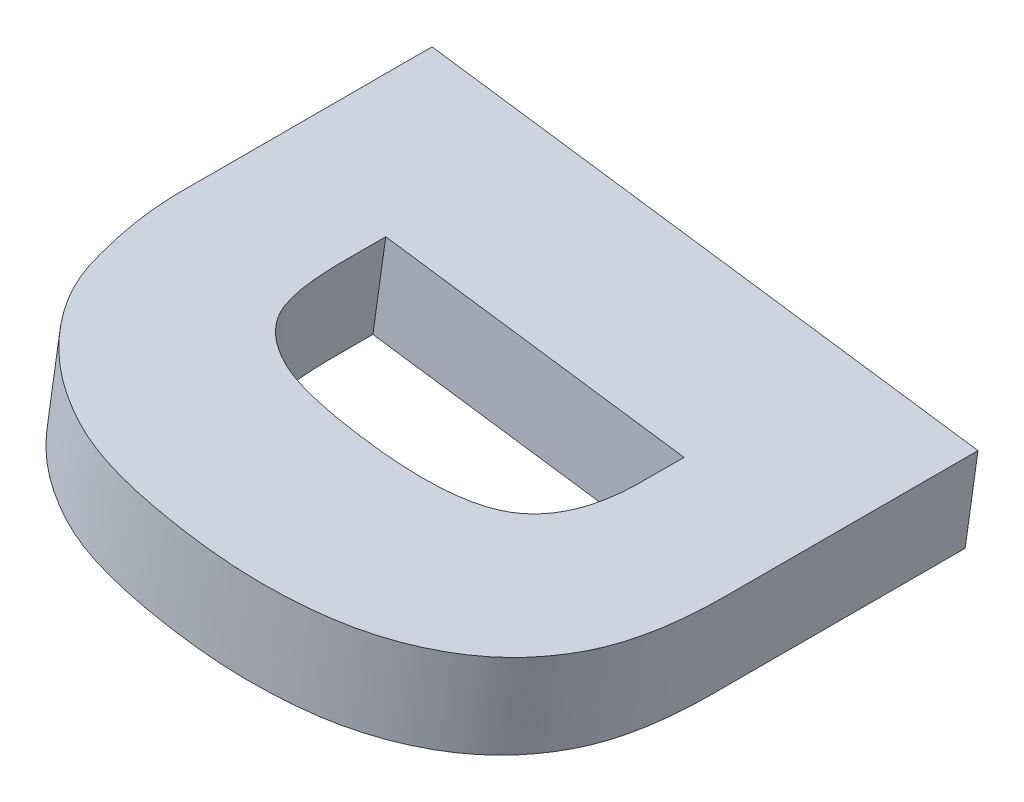
ISO-10303-21;
HEADER;
FILE_DESCRIPTION(('STEP AP214'),'2;1');
FILE_NAME('part.step','',(''),(''),'','','');
FILE_SCHEMA(('AUTOMOTIVE_DESIGN { 1 0 10303 214 1 1 1 1 }'));
ENDSEC;
DATA;
#1=APPLICATION_CONTEXT('core data for automotive mechanical design processes');
#2=APPLICATION_PROTOCOL_DEFINITION('international standard','automotive_design',2000,#1);
#3=PRODUCT_CONTEXT('',#1,'mechanical');
#4=PRODUCT('Part','Part','',(#3));
#5=PRODUCT_RELATED_PRODUCT_CATEGORY('part','',(#4));
#6=PRODUCT_DEFINITION_FORMATION('','',#4);
#7=PRODUCT_DEFINITION_CONTEXT('part definition',#1,'design');
#8=PRODUCT_DEFINITION('design','',#6,#7);
#9=PRODUCT_DEFINITION_SHAPE('','',#8);
#10=(LENGTH_UNIT() NAMED_UNIT(*) SI_UNIT(.MILLI.,.METRE.));
#11=(NAMED_UNIT(*) PLANE_ANGLE_UNIT() SI_UNIT($,.RADIAN.));
#12=(NAMED_UNIT(*) SI_UNIT($,.STERADIAN.) SOLID_ANGLE_UNIT());
#13=UNCERTAINTY_MEASURE_WITH_UNIT(LENGTH_MEASURE(1.E-05),#10,'distance_accuracy_value','');
#14=(GEOMETRIC_REPRESENTATION_CONTEXT(3) GLOBAL_UNCERTAINTY_ASSIGNED_CONTEXT((#13)) GLOBAL_UNIT_ASSIGNED_CONTEXT((#10,
#11,#12)) REPRESENTATION_CONTEXT('',''));
#15=CARTESIAN_POINT('',(0.,0.,0.));
#16=DIRECTION('',(0.,0.,1.));
#17=DIRECTION('',(1.,0.,0.));
#18=AXIS2_PLACEMENT_3D('',#15,#16,#17);
#19=CARTESIAN_POINT('',(694.201383765788,638.205810341441,1741.43993023574));
#20=CARTESIAN_POINT('',(694.20162457598,638.207523794991,1743.71141661628));
#21=CARTESIAN_POINT('',(694.201865386173,638.209237248542,1745.98290299682));
#22=CARTESIAN_POINT('',(694.202481513151,638.213621219788,1751.79463391641));
#23=CARTESIAN_POINT('',(695.479417598781,638.036048526415,1754.25029486835));
#24=CARTESIAN_POINT('',(696.756353684412,637.858475833041,1756.70595582028));
#25=CARTESIAN_POINT('',(699.938058236267,637.412386835859,1758.09749702638));
#26=CARTESIAN_POINT('',(703.119762788122,636.966297838678,1759.48903823248));
#27=CARTESIAN_POINT('',(710.252935234174,635.963795829034,1759.48903823248));
#28=CARTESIAN_POINT('',(719.696282847412,634.636619873084,1759.48903823248));
#29=CARTESIAN_POINT('',(723.18148053454,634.144414585745,1756.37853436002));
#30=CARTESIAN_POINT('',(726.666678221669,633.652209298407,1753.26803048757));
#31=CARTESIAN_POINT('',(726.66591457133,633.646775643905,1746.06475836188));
#32=CARTESIAN_POINT('',(726.665669422215,633.645031317317,1743.75234429881));
#33=CARTESIAN_POINT('',(726.6654242731,633.64328699073,1741.43993023574));
#34=B_SPLINE_CURVE_WITH_KNOTS('',2,(#19,#20,#21,#22,#23,#24,#25,#26,#27,#28,#29,#30,#31,#32,
#33),.UNSPECIFIED.,.F.,.F.,(3,2,2,2,2,2,2,3),(1.,2.,3.,4.,5.,6.,7.,8.),.UNSPECIFIED.);
#35=DIRECTION('',(-0.139173060582166,-0.990267781437723,0.000761744447259827));
#36=VECTOR('',#35,1.);
#37=SURFACE_OF_LINEAR_EXTRUSION('',#34,#36);
#38=CARTESIAN_POINT('',(692.809653159966,628.303132527064,1741.4475476802));
#39=CARTESIAN_POINT('',(692.809893970159,628.304845980614,1743.71903406075));
#40=CARTESIAN_POINT('',(692.810134780351,628.306559434164,1745.99052044129));
#41=CARTESIAN_POINT('',(692.810750907329,628.31094340541,1751.80225136088));
#42=CARTESIAN_POINT('',(694.087686992959,628.133370712037,1754.25791231282));
#43=CARTESIAN_POINT('',(695.36462307859,627.955798018664,1756.71357326476));
#44=CARTESIAN_POINT('',(698.546327630445,627.509709021482,1758.10511447085));
#45=CARTESIAN_POINT('',(701.728032182301,627.063620024301,1759.49665567696));
#46=CARTESIAN_POINT('',(708.861204628352,626.061118014656,1759.49665567696));
#47=CARTESIAN_POINT('',(718.30455224159,624.733942058707,1759.49665567696));
#48=CARTESIAN_POINT('',(721.789749928718,624.241736771368,1756.3861518045));
#49=CARTESIAN_POINT('',(725.274947615847,623.74953148403,1753.27564793204));
#50=CARTESIAN_POINT('',(725.274183965508,623.744097829527,1746.07237580636));
#51=CARTESIAN_POINT('',(725.273938816393,623.74235350294,1743.75996174328));
#52=CARTESIAN_POINT('',(725.273693667279,623.740609176353,1741.4475476802));
#53=B_SPLINE_CURVE_WITH_KNOTS('',2,(#38,#39,#40,#41,#42,#43,#44,#45,#46,#47,#48,#49,#50,#51,
#52),.UNSPECIFIED.,.F.,.F.,(3,2,2,2,2,2,2,3),(1.,2.,3.,4.,5.,6.,7.,8.),.UNSPECIFIED.);
#54=CARTESIAN_POINT('',(692.809653159966,628.303132527064,1741.4475476802));
#55=VERTEX_POINT('',#54);
#56=CARTESIAN_POINT('',(725.273693667279,623.740609176353,1741.4475476802));
#57=VERTEX_POINT('',#56);
#58=EDGE_CURVE('E78',#55,#57,#53,.T.);
#59=ORIENTED_EDGE('',*,*,#58,.F.);
#60=DIRECTION('',(-0.139173060582166,-0.990267781437723,0.000761744447259827));
#61=VECTOR('',#60,1.);
#62=CARTESIAN_POINT('',(694.201383765788,638.205810341441,1741.43993023574));
#63=LINE('',#62,#61);
#64=CARTESIAN_POINT('',(694.201383765788,638.205810341441,1741.43993023574));
#65=VERTEX_POINT('',#64);
#66=EDGE_CURVE('E28',#65,#55,#63,.T.);
#67=ORIENTED_EDGE('',*,*,#66,.F.);
#68=CARTESIAN_POINT('',(726.6654242731,633.64328699073,1741.43993023574));
#69=VERTEX_POINT('',#68);
#70=EDGE_CURVE('E73',#65,#69,#34,.T.);
#71=ORIENTED_EDGE('',*,*,#70,.T.);
#72=DIRECTION('',(-0.139173060582166,-0.990267781437723,0.000761744447259827));
#73=VECTOR('',#72,1.);
#74=CARTESIAN_POINT('',(726.6654242731,633.64328699073,1741.43993023574));
#75=LINE('',#74,#73);
#76=EDGE_CURVE('E11',#69,#57,#75,.T.);
#77=ORIENTED_EDGE('',*,*,#76,.T.);
#78=EDGE_LOOP('',(#59,#67,#71,#77));
#79=FACE_BOUND('',#78,.T.);
#80=ADVANCED_FACE('F17',(#79),#37,.T.);
#81=CARTESIAN_POINT('',(740.119215855403,631.73821816862,1722.8996900486));
#82=CARTESIAN_POINT('',(740.120675902785,631.748606945552,1736.67185522072));
#83=CARTESIAN_POINT('',(740.122135950166,631.758995722483,1750.44402039284));
#84=CARTESIAN_POINT('',(740.12299939572,631.765139456835,1758.58862921677));
#85=CARTESIAN_POINT('',(737.934943913219,632.076507247729,1763.60227032698));
#86=CARTESIAN_POINT('',(735.746888430718,632.387875038623,1768.61591143718));
#87=CARTESIAN_POINT('',(731.653767265809,632.965644330295,1771.89012603977));
#88=CARTESIAN_POINT('',(727.560646100899,633.543413621966,1775.16434064236));
#89=CARTESIAN_POINT('',(722.129864189771,634.307793626821,1776.63773721351));
#90=CARTESIAN_POINT('',(716.699082278642,635.072173631676,1778.11113378468));
#91=CARTESIAN_POINT('',(710.619673943939,635.926578753532,1778.11113378468));
#92=CARTESIAN_POINT('',(701.095267552905,637.265146777773,1778.11113378468));
#93=CARTESIAN_POINT('',(695.846479558265,638.001131492165,1775.9215027692));
#94=CARTESIAN_POINT('',(690.597691563624,638.737116206557,1773.73187175372));
#95=CARTESIAN_POINT('',(687.050957837421,639.232586255797,1769.84374191316));
#96=CARTESIAN_POINT('',(683.504224111218,639.728056305037,1765.95561207258));
#97=CARTESIAN_POINT('',(682.322681469885,639.890680853126,1761.49603882509));
#98=CARTESIAN_POINT('',(680.70657683528,640.113117417559,1755.39626997925));
#99=CARTESIAN_POINT('',(680.706051825672,640.109381780089,1750.44402039284));
#100=CARTESIAN_POINT('',(680.704591778291,640.098993003157,1736.67185522072));
#101=CARTESIAN_POINT('',(680.703131730909,640.088604226225,1722.8996900486));
#102=B_SPLINE_CURVE_WITH_KNOTS('',2,(#81,#82,#83,#84,#85,#86,#87,#88,#89,#90,#91,#92,#93,#94,
#95,#96,#97,#98,#99,#100,#101),.UNSPECIFIED.,.F.,.F.,(3,2,2,2,2,2,2,2,2,2,3),(0.,1.,2.,3.,4.,5.,
6.,7.,8.,9.,10.),.UNSPECIFIED.);
#103=DIRECTION('',(-0.139173060582166,-0.990267781437723,0.000761744447259827));
#104=VECTOR('',#103,1.);
#105=SURFACE_OF_LINEAR_EXTRUSION('',#102,#104);
#106=CARTESIAN_POINT('',(738.727485249581,621.835540354243,1722.90730749307));
#107=CARTESIAN_POINT('',(738.728945296963,621.845929131174,1736.6794726652));
#108=CARTESIAN_POINT('',(738.730405344345,621.856317908106,1750.45163783732));
#109=CARTESIAN_POINT('',(738.731268789899,621.862461642458,1758.59624666124));
#110=CARTESIAN_POINT('',(736.543213307397,622.173829433352,1763.60988777145));
#111=CARTESIAN_POINT('',(734.355157824896,622.485197224245,1768.62352888165));
#112=CARTESIAN_POINT('',(730.262036659987,623.062966515917,1771.89774348424));
#113=CARTESIAN_POINT('',(726.168915495078,623.640735807589,1775.17195808683));
#114=CARTESIAN_POINT('',(720.738133583949,624.405115812444,1776.64535465799));
#115=CARTESIAN_POINT('',(715.30735167282,625.169495817299,1778.11875122915));
#116=CARTESIAN_POINT('',(709.227943338118,626.023900939154,1778.11875122915));
#117=CARTESIAN_POINT('',(699.703536947084,627.362468963395,1778.11875122915));
#118=CARTESIAN_POINT('',(694.454748952443,628.098453677788,1775.92912021368));
#119=CARTESIAN_POINT('',(689.205960957802,628.83443839218,1773.7394891982));
#120=CARTESIAN_POINT('',(685.659227231599,629.32990844142,1769.85135935763));
#121=CARTESIAN_POINT('',(682.112493505396,629.825378490659,1765.96322951706));
#122=CARTESIAN_POINT('',(680.930950864064,629.988003038749,1761.50365626956));
#123=CARTESIAN_POINT('',(679.314846229459,630.210439603182,1755.40388742372));
#124=CARTESIAN_POINT('',(679.314321219851,630.206703965711,1750.45163783732));
#125=CARTESIAN_POINT('',(679.312861172469,630.19631518878,1736.6794726652));
#126=CARTESIAN_POINT('',(679.311401125088,630.185926411848,1722.90730749307));
#127=B_SPLINE_CURVE_WITH_KNOTS('',2,(#106,#107,#108,#109,#110,#111,#112,#113,#114,#115,#116,
#117,#118,#119,#120,#121,#122,#123,#124,#125,#126),.UNSPECIFIED.,.F.,.F.,(3,2,2,2,2,2,2,2,2,2,
3),(0.,1.,2.,3.,4.,5.,6.,7.,8.,9.,10.),.UNSPECIFIED.);
#128=CARTESIAN_POINT('',(738.727485249581,621.835540354243,1722.90730749307));
#129=VERTEX_POINT('',#128);
#130=CARTESIAN_POINT('',(679.311401125088,630.185926411848,1722.90730749307));
#131=VERTEX_POINT('',#130);
#132=EDGE_CURVE('E67',#129,#131,#127,.T.);
#133=ORIENTED_EDGE('',*,*,#132,.F.);
#134=DIRECTION('',(-0.139173060582166,-0.990267781437723,0.000761744447259827));
#135=VECTOR('',#134,1.);
#136=CARTESIAN_POINT('',(740.119215855403,631.73821816862,1722.8996900486));
#137=LINE('',#136,#135);
#138=CARTESIAN_POINT('',(740.119215855403,631.73821816862,1722.8996900486));
#139=VERTEX_POINT('',#138);
#140=EDGE_CURVE('E63',#139,#129,#137,.T.);
#141=ORIENTED_EDGE('',*,*,#140,.F.);
#142=CARTESIAN_POINT('',(680.703131730909,640.088604226225,1722.8996900486));
#143=VERTEX_POINT('',#142);
#144=EDGE_CURVE('E65',#139,#143,#102,.T.);
#145=ORIENTED_EDGE('',*,*,#144,.T.);
#146=DIRECTION('',(-0.139173060582166,-0.990267781437723,0.000761744447259827));
#147=VECTOR('',#146,1.);
#148=CARTESIAN_POINT('',(680.703131730909,640.088604226225,1722.8996900486));
#149=LINE('',#148,#147);
#150=EDGE_CURVE('E22',#143,#131,#149,.T.);
#151=ORIENTED_EDGE('',*,*,#150,.T.);
#152=EDGE_LOOP('',(#133,#141,#145,#151));
#153=FACE_BOUND('',#152,.T.);
#154=ADVANCED_FACE('F19',(#153),#105,.T.);
#155=CARTESIAN_POINT('',(680.703131730909,640.088604226225,1722.8996900486));
#156=DIRECTION('',(-0.000106014336864278,-0.000754331202662602,-0.999999709872657));
#157=DIRECTION('',(-0.990268068741567,0.139173100960088,0.));
#158=AXIS2_PLACEMENT_3D('',#155,#156,#157);
#159=PLANE('',#158);
#160=CARTESIAN_POINT('',(679.311401125088,630.185926411848,1722.90730749307));
#161=CARTESIAN_POINT('',(709.019443187335,626.010733383046,1722.90730749307));
#162=CARTESIAN_POINT('',(738.727485249581,621.835540354243,1722.90730749307));
#163=B_SPLINE_CURVE_WITH_KNOTS('',2,(#160,#161,#162),.UNSPECIFIED.,.F.,.F.,(3,3),(10.,11.),.UNSPECIFIED.);
#164=EDGE_CURVE('E161',#131,#129,#163,.T.);
#165=ORIENTED_EDGE('',*,*,#164,.F.);
#166=ORIENTED_EDGE('',*,*,#150,.F.);
#167=CARTESIAN_POINT('',(680.703131730909,640.088604226225,1722.8996900486));
#168=CARTESIAN_POINT('',(710.411173793156,635.913411197423,1722.8996900486));
#169=CARTESIAN_POINT('',(740.119215855403,631.73821816862,1722.8996900486));
#170=B_SPLINE_CURVE_WITH_KNOTS('',2,(#167,#168,#169),.UNSPECIFIED.,.F.,.F.,(3,3),(10.,11.),.UNSPECIFIED.);
#171=EDGE_CURVE('E70',#143,#139,#170,.T.);
#172=ORIENTED_EDGE('',*,*,#171,.T.);
#173=ORIENTED_EDGE('',*,*,#140,.T.);
#174=EDGE_LOOP('',(#165,#166,#172,#173));
#175=FACE_BOUND('',#174,.T.);
#176=ADVANCED_FACE('F71',(#175),#159,.T.);
#177=CARTESIAN_POINT('',(726.6654242731,633.64328699073,1741.43993023574));
#178=DIRECTION('',(0.000106014336864278,0.000754331202662602,0.999999709872657));
#179=DIRECTION('',(0.990268068741567,-0.139173100960088,0.));
#180=AXIS2_PLACEMENT_3D('',#177,#178,#179);
#181=PLANE('',#180);
#182=CARTESIAN_POINT('',(725.273693667279,623.740609176353,1741.4475476802));
#183=CARTESIAN_POINT('',(709.041673413623,626.021870851708,1741.4475476802));
#184=CARTESIAN_POINT('',(692.809653159966,628.303132527064,1741.4475476802));
#185=B_SPLINE_CURVE_WITH_KNOTS('',2,(#182,#183,#184),.UNSPECIFIED.,.F.,.F.,(3,3),(0.,1.),.UNSPECIFIED.);
#186=EDGE_CURVE('E77',#57,#55,#185,.T.);
#187=ORIENTED_EDGE('',*,*,#186,.F.);
#188=ORIENTED_EDGE('',*,*,#76,.F.);
#189=CARTESIAN_POINT('',(726.6654242731,633.64328699073,1741.43993023574));
#190=CARTESIAN_POINT('',(710.433404019444,635.924548666086,1741.43993023574));
#191=CARTESIAN_POINT('',(694.201383765788,638.205810341441,1741.43993023574));
#192=B_SPLINE_CURVE_WITH_KNOTS('',2,(#189,#190,#191),.UNSPECIFIED.,.F.,.F.,(3,3),(0.,1.),.UNSPECIFIED.);
#193=EDGE_CURVE('E69',#69,#65,#192,.T.);
#194=ORIENTED_EDGE('',*,*,#193,.T.);
#195=ORIENTED_EDGE('',*,*,#66,.T.);
#196=EDGE_LOOP('',(#187,#188,#194,#195));
#197=FACE_BOUND('',#196,.T.);
#198=ADVANCED_FACE('F105',(#197),#181,.T.);
#199=CARTESIAN_POINT('',(710.619673943939,635.926578753532,1778.11113378468));
#200=DIRECTION('',(0.139173060582263,0.990267781437709,-0.000761744447251766));
#201=DIRECTION('',(-0.990268068741554,0.139173100960185,0.));
#202=AXIS2_PLACEMENT_3D('',#199,#200,#201);
#203=PLANE('',#202);
#204=ORIENTED_EDGE('',*,*,#144,.F.);
#205=ORIENTED_EDGE('',*,*,#171,.F.);
#206=EDGE_LOOP('',(#204,#205));
#207=FACE_BOUND('',#206,.T.);
#208=ORIENTED_EDGE('',*,*,#70,.F.);
#209=ORIENTED_EDGE('',*,*,#193,.F.);
#210=EDGE_LOOP('',(#208,#209));
#211=FACE_BOUND('',#210,.T.);
#212=ADVANCED_FACE('F75',(#207,#211),#203,.T.);
#213=CARTESIAN_POINT('',(709.227943338118,626.023900939154,1778.11875122915));
#214=DIRECTION('',(0.139173060582263,0.990267781437709,-0.000761744447251766));
#215=DIRECTION('',(-0.990268068741554,0.139173100960185,0.));
#216=AXIS2_PLACEMENT_3D('',#213,#214,#215);
#217=PLANE('',#216);
#218=ORIENTED_EDGE('',*,*,#132,.T.);
#219=ORIENTED_EDGE('',*,*,#164,.T.);
#220=EDGE_LOOP('',(#218,#219));
#221=FACE_BOUND('',#220,.T.);
#222=ORIENTED_EDGE('',*,*,#58,.T.);
#223=ORIENTED_EDGE('',*,*,#186,.T.);
#224=EDGE_LOOP('',(#222,#223));
#225=FACE_BOUND('',#224,.T.);
#226=ADVANCED_FACE('F146',(#221,#225),#217,.F.);
#227=CLOSED_SHELL('',(#80,#154,#176,#198,#212,#226));
#228=MANIFOLD_SOLID_BREP('B1',#227);
#229=ADVANCED_BREP_SHAPE_REPRESENTATION('',(#18,#228),#14);
#230=SHAPE_DEFINITION_REPRESENTATION(#9,#229);
ENDSEC;
END-ISO-10303-21;
